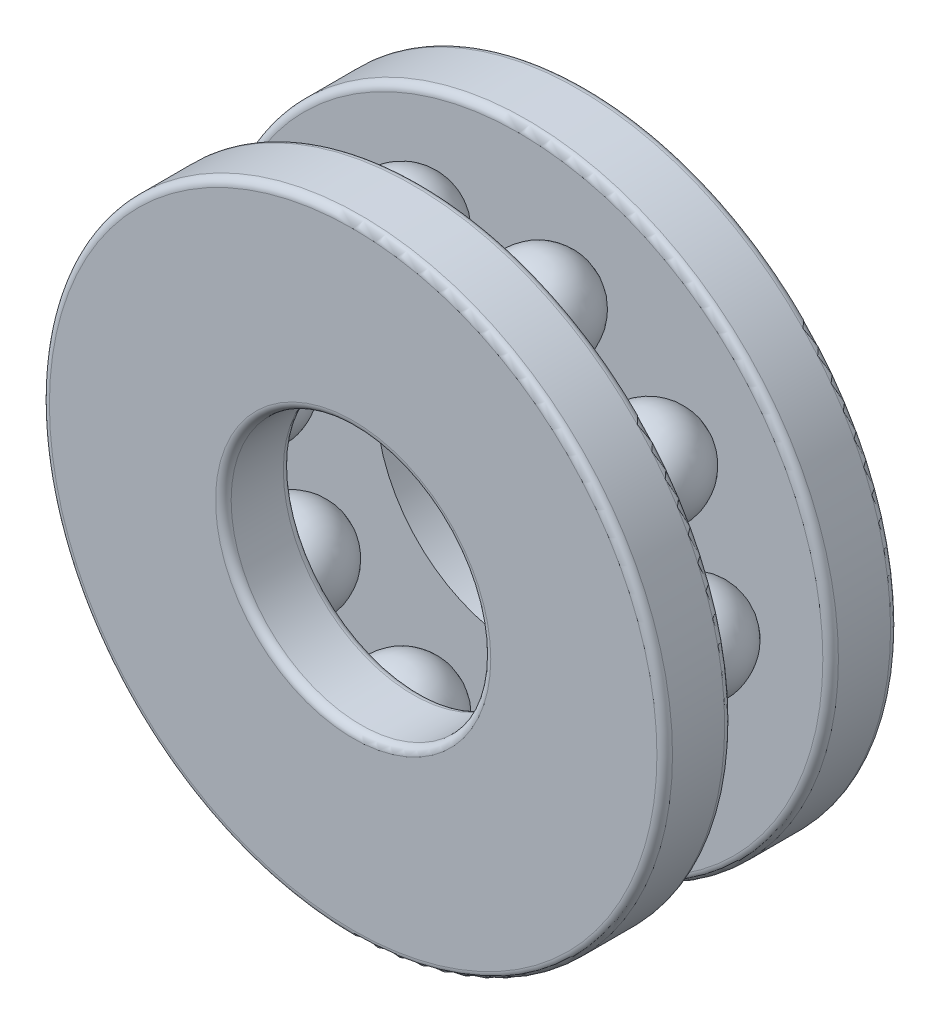
ISO-10303-21;
HEADER;
FILE_DESCRIPTION(('STEP AP214'),'2;1');
FILE_NAME('part.step','',(''),(''),'','','');
FILE_SCHEMA(('AUTOMOTIVE_DESIGN { 1 0 10303 214 1 1 1 1 }'));
ENDSEC;
DATA;
#1=APPLICATION_CONTEXT('core data for automotive mechanical design processes');
#2=APPLICATION_PROTOCOL_DEFINITION('international standard','automotive_design',2000,#1);
#3=PRODUCT_CONTEXT('',#1,'mechanical');
#4=PRODUCT('Part','Part','',(#3));
#5=PRODUCT_RELATED_PRODUCT_CATEGORY('part','',(#4));
#6=PRODUCT_DEFINITION_FORMATION('','',#4);
#7=PRODUCT_DEFINITION_CONTEXT('part definition',#1,'design');
#8=PRODUCT_DEFINITION('design','',#6,#7);
#9=PRODUCT_DEFINITION_SHAPE('','',#8);
#10=(LENGTH_UNIT() NAMED_UNIT(*) SI_UNIT(.MILLI.,.METRE.));
#11=(NAMED_UNIT(*) PLANE_ANGLE_UNIT() SI_UNIT($,.RADIAN.));
#12=(NAMED_UNIT(*) SI_UNIT($,.STERADIAN.) SOLID_ANGLE_UNIT());
#13=UNCERTAINTY_MEASURE_WITH_UNIT(LENGTH_MEASURE(1.E-05),#10,'distance_accuracy_value','');
#14=(GEOMETRIC_REPRESENTATION_CONTEXT(3) GLOBAL_UNCERTAINTY_ASSIGNED_CONTEXT((#13)) GLOBAL_UNIT_ASSIGNED_CONTEXT((#10,
#11,#12)) REPRESENTATION_CONTEXT('',''));
#15=CARTESIAN_POINT('',(0.,0.,0.));
#16=DIRECTION('',(0.,0.,1.));
#17=DIRECTION('',(1.,0.,0.));
#18=AXIS2_PLACEMENT_3D('',#15,#16,#17);
#19=CARTESIAN_POINT('',(6.87664445218705,-4.99617464448602,0.));
#20=DIRECTION('',(-0.809016994374947,0.587785252292473,0.));
#21=DIRECTION('',(0.,0.,-1.));
#22=AXIS2_PLACEMENT_3D('',#19,#20,#21);
#23=SPHERICAL_SURFACE('',#22,1.89);
#24=CARTESIAN_POINT('',(5.3476023328184,-3.88526051765325,0.));
#25=VERTEX_POINT('',#24);
#26=VERTEX_LOOP('',#25);
#27=FACE_BOUND('',#26,.T.);
#28=ADVANCED_FACE('F38',(#27),#23,.T.);
#29=CLOSED_SHELL('',(#28));
#30=MANIFOLD_SOLID_BREP('B2',#29);
#31=CARTESIAN_POINT('',(2.62664445218705,-8.08398038850881,0.));
#32=DIRECTION('',(-0.309016994374947,0.951056516295154,0.));
#33=DIRECTION('',(0.,0.,-1.));
#34=AXIS2_PLACEMENT_3D('',#31,#32,#33);
#35=SPHERICAL_SURFACE('',#34,1.89);
#36=CARTESIAN_POINT('',(2.0426023328184,-6.28648357271097,0.));
#37=VERTEX_POINT('',#36);
#38=VERTEX_LOOP('',#37);
#39=FACE_BOUND('',#38,.T.);
#40=ADVANCED_FACE('F57',(#39),#35,.T.);
#41=CLOSED_SHELL('',(#40));
#42=MANIFOLD_SOLID_BREP('B6',#41);
#43=CARTESIAN_POINT('',(-2.62664445218705,-8.08398038850881,0.));
#44=DIRECTION('',(0.309016994374948,0.951056516295154,0.));
#45=DIRECTION('',(0.,0.,-1.));
#46=AXIS2_PLACEMENT_3D('',#43,#44,#45);
#47=SPHERICAL_SURFACE('',#46,1.89);
#48=CARTESIAN_POINT('',(-2.0426023328184,-6.28648357271097,0.));
#49=VERTEX_POINT('',#48);
#50=VERTEX_LOOP('',#49);
#51=FACE_BOUND('',#50,.T.);
#52=ADVANCED_FACE('F76',(#51),#47,.T.);
#53=CLOSED_SHELL('',(#52));
#54=MANIFOLD_SOLID_BREP('B34',#53);
#55=CARTESIAN_POINT('',(-6.87664445218706,-4.99617464448602,0.));
#56=DIRECTION('',(0.809016994374948,0.587785252292473,0.));
#57=DIRECTION('',(0.,0.,-1.));
#58=AXIS2_PLACEMENT_3D('',#55,#56,#57);
#59=SPHERICAL_SURFACE('',#58,1.89);
#60=CARTESIAN_POINT('',(-5.34760233281841,-3.88526051765325,0.));
#61=VERTEX_POINT('',#60);
#62=VERTEX_LOOP('',#61);
#63=FACE_BOUND('',#62,.T.);
#64=ADVANCED_FACE('F95',(#63),#59,.T.);
#65=CLOSED_SHELL('',(#64));
#66=MANIFOLD_SOLID_BREP('B53',#65);
#67=CARTESIAN_POINT('',(-8.5,0.,0.));
#68=DIRECTION('',(1.,0.,0.));
#69=DIRECTION('',(0.,0.,-1.));
#70=AXIS2_PLACEMENT_3D('',#67,#68,#69);
#71=SPHERICAL_SURFACE('',#70,1.89);
#72=CARTESIAN_POINT('',(-6.61,0.,0.));
#73=VERTEX_POINT('',#72);
#74=VERTEX_LOOP('',#73);
#75=FACE_BOUND('',#74,.T.);
#76=ADVANCED_FACE('F114',(#75),#71,.T.);
#77=CLOSED_SHELL('',(#76));
#78=MANIFOLD_SOLID_BREP('B72',#77);
#79=CARTESIAN_POINT('',(-6.87664445218705,4.99617464448602,0.));
#80=DIRECTION('',(0.809016994374947,-0.587785252292473,0.));
#81=DIRECTION('',(0.,0.,-1.));
#82=AXIS2_PLACEMENT_3D('',#79,#80,#81);
#83=SPHERICAL_SURFACE('',#82,1.89);
#84=CARTESIAN_POINT('',(-5.3476023328184,3.88526051765325,0.));
#85=VERTEX_POINT('',#84);
#86=VERTEX_LOOP('',#85);
#87=FACE_BOUND('',#86,.T.);
#88=ADVANCED_FACE('F133',(#87),#83,.T.);
#89=CLOSED_SHELL('',(#88));
#90=MANIFOLD_SOLID_BREP('B91',#89);
#91=CARTESIAN_POINT('',(-2.62664445218705,8.08398038850881,0.));
#92=DIRECTION('',(0.309016994374947,-0.951056516295154,0.));
#93=DIRECTION('',(0.,0.,-1.));
#94=AXIS2_PLACEMENT_3D('',#91,#92,#93);
#95=SPHERICAL_SURFACE('',#94,1.89);
#96=CARTESIAN_POINT('',(-2.0426023328184,6.28648357271097,0.));
#97=VERTEX_POINT('',#96);
#98=VERTEX_LOOP('',#97);
#99=FACE_BOUND('',#98,.T.);
#100=ADVANCED_FACE('F152',(#99),#95,.T.);
#101=CLOSED_SHELL('',(#100));
#102=MANIFOLD_SOLID_BREP('B110',#101);
#103=CARTESIAN_POINT('',(2.62664445218705,8.08398038850881,0.));
#104=DIRECTION('',(-0.309016994374948,-0.951056516295154,0.));
#105=DIRECTION('',(0.,0.,-1.));
#106=AXIS2_PLACEMENT_3D('',#103,#104,#105);
#107=SPHERICAL_SURFACE('',#106,1.89);
#108=CARTESIAN_POINT('',(2.0426023328184,6.28648357271097,0.));
#109=VERTEX_POINT('',#108);
#110=VERTEX_LOOP('',#109);
#111=FACE_BOUND('',#110,.T.);
#112=ADVANCED_FACE('F171',(#111),#107,.T.);
#113=CLOSED_SHELL('',(#112));
#114=MANIFOLD_SOLID_BREP('B129',#113);
#115=CARTESIAN_POINT('',(6.87664445218705,4.99617464448602,0.));
#116=DIRECTION('',(-0.809016994374947,-0.587785252292473,0.));
#117=DIRECTION('',(0.,0.,-1.));
#118=AXIS2_PLACEMENT_3D('',#115,#116,#117);
#119=SPHERICAL_SURFACE('',#118,1.89);
#120=CARTESIAN_POINT('',(5.3476023328184,3.88526051765325,0.));
#121=VERTEX_POINT('',#120);
#122=VERTEX_LOOP('',#121);
#123=FACE_BOUND('',#122,.T.);
#124=ADVANCED_FACE('F190',(#123),#119,.T.);
#125=CLOSED_SHELL('',(#124));
#126=MANIFOLD_SOLID_BREP('B148',#125);
#127=CARTESIAN_POINT('',(8.5,0.,0.));
#128=DIRECTION('',(-1.,0.,0.));
#129=DIRECTION('',(0.,0.,-1.));
#130=AXIS2_PLACEMENT_3D('',#127,#128,#129);
#131=SPHERICAL_SURFACE('',#130,1.89);
#132=CARTESIAN_POINT('',(6.61,0.,0.));
#133=VERTEX_POINT('',#132);
#134=VERTEX_LOOP('',#133);
#135=FACE_BOUND('',#134,.T.);
#136=ADVANCED_FACE('F211',(#135),#131,.T.);
#137=CLOSED_SHELL('',(#136));
#138=MANIFOLD_SOLID_BREP('B167',#137);
#139=CARTESIAN_POINT('',(0.,0.,7.75));
#140=DIRECTION('',(0.,0.,1.));
#141=DIRECTION('',(1.,0.,0.));
#142=AXIS2_PLACEMENT_3D('',#139,#140,#141);
#143=CYLINDRICAL_SURFACE('',#142,5.5);
#144=CARTESIAN_POINT('',(0.,0.,-1.89));
#145=DIRECTION('',(0.,0.,1.));
#146=DIRECTION('',(1.,0.,0.));
#147=AXIS2_PLACEMENT_3D('',#144,#145,#146);
#148=CIRCLE('',#147,5.5);
#149=CARTESIAN_POINT('',(5.5,0.,-1.89));
#150=VERTEX_POINT('',#149);
#151=EDGE_CURVE('E251',#150,#150,#148,.T.);
#152=ORIENTED_EDGE('',*,*,#151,.T.);
#153=EDGE_LOOP('',(#152));
#154=FACE_BOUND('',#153,.T.);
#155=CARTESIAN_POINT('',(0.,0.,-4.5));
#156=DIRECTION('',(0.,0.,1.));
#157=DIRECTION('',(1.,0.,0.));
#158=AXIS2_PLACEMENT_3D('',#155,#156,#157);
#159=CIRCLE('',#158,5.5);
#160=CARTESIAN_POINT('',(5.5,0.,-4.5));
#161=VERTEX_POINT('',#160);
#162=EDGE_CURVE('E254',#161,#161,#159,.T.);
#163=ORIENTED_EDGE('',*,*,#162,.F.);
#164=EDGE_LOOP('',(#163));
#165=FACE_BOUND('',#164,.T.);
#166=ADVANCED_FACE('F231',(#154,#165),#143,.F.);
#167=CARTESIAN_POINT('',(5.5,0.,-1.89));
#168=DIRECTION('',(0.,0.,1.));
#169=DIRECTION('',(1.,0.,0.));
#170=AXIS2_PLACEMENT_3D('',#167,#168,#169);
#171=PLANE('',#170);
#172=CARTESIAN_POINT('',(0.,0.,-1.89));
#173=DIRECTION('',(0.,0.,1.));
#174=DIRECTION('',(1.,0.,0.));
#175=AXIS2_PLACEMENT_3D('',#172,#173,#174);
#176=CIRCLE('',#175,11.7);
#177=CARTESIAN_POINT('',(11.7,0.,-1.89));
#178=VERTEX_POINT('',#177);
#179=EDGE_CURVE('E210',#178,#178,#176,.T.);
#180=ORIENTED_EDGE('',*,*,#179,.T.);
#181=EDGE_LOOP('',(#180));
#182=FACE_BOUND('',#181,.T.);
#183=ORIENTED_EDGE('',*,*,#151,.F.);
#184=EDGE_LOOP('',(#183));
#185=FACE_BOUND('',#184,.T.);
#186=ADVANCED_FACE('F261',(#182,#185),#171,.T.);
#187=CARTESIAN_POINT('',(0.,0.,7.75));
#188=DIRECTION('',(0.,0.,1.));
#189=DIRECTION('',(1.,0.,0.));
#190=AXIS2_PLACEMENT_3D('',#187,#188,#189);
#191=CYLINDRICAL_SURFACE('',#190,12.);
#192=CARTESIAN_POINT('',(0.,0.,-4.2));
#193=DIRECTION('',(0.,0.,-1.));
#194=DIRECTION('',(-1.,0.,0.));
#195=AXIS2_PLACEMENT_3D('',#192,#193,#194);
#196=CIRCLE('',#195,12.);
#197=CARTESIAN_POINT('',(-12.,0.,-4.2));
#198=VERTEX_POINT('',#197);
#199=EDGE_CURVE('E242',#198,#198,#196,.F.);
#200=ORIENTED_EDGE('',*,*,#199,.T.);
#201=EDGE_LOOP('',(#200));
#202=FACE_BOUND('',#201,.T.);
#203=CARTESIAN_POINT('',(0.,0.,-2.19));
#204=DIRECTION('',(0.,0.,1.));
#205=DIRECTION('',(1.,0.,0.));
#206=AXIS2_PLACEMENT_3D('',#203,#204,#205);
#207=CIRCLE('',#206,12.);
#208=CARTESIAN_POINT('',(12.,0.,-2.19));
#209=VERTEX_POINT('',#208);
#210=EDGE_CURVE('E246',#209,#209,#207,.F.);
#211=ORIENTED_EDGE('',*,*,#210,.T.);
#212=EDGE_LOOP('',(#211));
#213=FACE_BOUND('',#212,.T.);
#214=ADVANCED_FACE('F267',(#202,#213),#191,.T.);
#215=CARTESIAN_POINT('',(12.,0.,-4.5));
#216=DIRECTION('',(0.,0.,-1.));
#217=DIRECTION('',(-1.,0.,0.));
#218=AXIS2_PLACEMENT_3D('',#215,#216,#217);
#219=PLANE('',#218);
#220=CARTESIAN_POINT('',(0.,0.,-4.5));
#221=DIRECTION('',(0.,0.,-1.));
#222=DIRECTION('',(-1.,0.,0.));
#223=AXIS2_PLACEMENT_3D('',#220,#221,#222);
#224=CIRCLE('',#223,11.7);
#225=CARTESIAN_POINT('',(-11.7,0.,-4.5));
#226=VERTEX_POINT('',#225);
#227=EDGE_CURVE('E238',#226,#226,#224,.T.);
#228=ORIENTED_EDGE('',*,*,#227,.T.);
#229=EDGE_LOOP('',(#228));
#230=FACE_BOUND('',#229,.T.);
#231=ORIENTED_EDGE('',*,*,#162,.T.);
#232=EDGE_LOOP('',(#231));
#233=FACE_BOUND('',#232,.T.);
#234=ADVANCED_FACE('F258',(#230,#233),#219,.T.);
#235=CARTESIAN_POINT('',(0.,0.,-4.2));
#236=DIRECTION('',(0.,0.,-1.));
#237=DIRECTION('',(-1.,0.,0.));
#238=AXIS2_PLACEMENT_3D('',#235,#236,#237);
#239=TOROIDAL_SURFACE('',#238,11.7,0.3);
#240=ORIENTED_EDGE('',*,*,#227,.F.);
#241=EDGE_LOOP('',(#240));
#242=FACE_BOUND('',#241,.T.);
#243=ORIENTED_EDGE('',*,*,#199,.F.);
#244=EDGE_LOOP('',(#243));
#245=FACE_BOUND('',#244,.T.);
#246=ADVANCED_FACE('F270',(#242,#245),#239,.T.);
#247=CARTESIAN_POINT('',(0.,0.,-2.19));
#248=DIRECTION('',(0.,0.,1.));
#249=DIRECTION('',(1.,0.,0.));
#250=AXIS2_PLACEMENT_3D('',#247,#248,#249);
#251=TOROIDAL_SURFACE('',#250,11.7,0.3);
#252=ORIENTED_EDGE('',*,*,#210,.F.);
#253=EDGE_LOOP('',(#252));
#254=FACE_BOUND('',#253,.T.);
#255=ORIENTED_EDGE('',*,*,#179,.F.);
#256=EDGE_LOOP('',(#255));
#257=FACE_BOUND('',#256,.T.);
#258=ADVANCED_FACE('F233',(#254,#257),#251,.T.);
#259=CLOSED_SHELL('',(#166,#186,#214,#234,#246,#258));
#260=MANIFOLD_SOLID_BREP('B186',#259);
#261=CARTESIAN_POINT('',(0.,0.,7.75));
#262=DIRECTION('',(0.,0.,1.));
#263=DIRECTION('',(1.,0.,0.));
#264=AXIS2_PLACEMENT_3D('',#261,#262,#263);
#265=CYLINDRICAL_SURFACE('',#264,5.);
#266=CARTESIAN_POINT('',(0.,0.,2.19));
#267=DIRECTION('',(0.,0.,-1.));
#268=DIRECTION('',(-1.,0.,0.));
#269=AXIS2_PLACEMENT_3D('',#266,#267,#268);
#270=CIRCLE('',#269,5.);
#271=CARTESIAN_POINT('',(-5.,0.,2.19));
#272=VERTEX_POINT('',#271);
#273=EDGE_CURVE('E343',#272,#272,#270,.T.);
#274=ORIENTED_EDGE('',*,*,#273,.T.);
#275=EDGE_LOOP('',(#274));
#276=FACE_BOUND('',#275,.T.);
#277=CARTESIAN_POINT('',(0.,0.,4.2));
#278=DIRECTION('',(0.,0.,1.));
#279=DIRECTION('',(1.,0.,0.));
#280=AXIS2_PLACEMENT_3D('',#277,#278,#279);
#281=CIRCLE('',#280,5.);
#282=CARTESIAN_POINT('',(5.,0.,4.2));
#283=VERTEX_POINT('',#282);
#284=EDGE_CURVE('E346',#283,#283,#281,.T.);
#285=ORIENTED_EDGE('',*,*,#284,.T.);
#286=EDGE_LOOP('',(#285));
#287=FACE_BOUND('',#286,.T.);
#288=ADVANCED_FACE('F323',(#276,#287),#265,.F.);
#289=CARTESIAN_POINT('',(5.,0.,4.5));
#290=DIRECTION('',(0.,0.,1.));
#291=DIRECTION('',(1.,0.,0.));
#292=AXIS2_PLACEMENT_3D('',#289,#290,#291);
#293=PLANE('',#292);
#294=CARTESIAN_POINT('',(0.,0.,4.5));
#295=DIRECTION('',(0.,0.,1.));
#296=DIRECTION('',(1.,0.,0.));
#297=AXIS2_PLACEMENT_3D('',#294,#295,#296);
#298=CIRCLE('',#297,11.7);
#299=CARTESIAN_POINT('',(11.7,0.,4.5));
#300=VERTEX_POINT('',#299);
#301=EDGE_CURVE('E230',#300,#300,#298,.T.);
#302=ORIENTED_EDGE('',*,*,#301,.T.);
#303=EDGE_LOOP('',(#302));
#304=FACE_BOUND('',#303,.T.);
#305=CARTESIAN_POINT('',(0.,0.,4.5));
#306=DIRECTION('',(0.,0.,1.));
#307=DIRECTION('',(1.,0.,0.));
#308=AXIS2_PLACEMENT_3D('',#305,#306,#307);
#309=CIRCLE('',#308,5.3);
#310=CARTESIAN_POINT('',(5.3,0.,4.5));
#311=VERTEX_POINT('',#310);
#312=EDGE_CURVE('E330',#311,#311,#309,.F.);
#313=ORIENTED_EDGE('',*,*,#312,.T.);
#314=EDGE_LOOP('',(#313));
#315=FACE_BOUND('',#314,.T.);
#316=ADVANCED_FACE('F369',(#304,#315),#293,.T.);
#317=CARTESIAN_POINT('',(0.,0.,7.75));
#318=DIRECTION('',(0.,0.,1.));
#319=DIRECTION('',(1.,0.,0.));
#320=AXIS2_PLACEMENT_3D('',#317,#318,#319);
#321=CYLINDRICAL_SURFACE('',#320,12.);
#322=CARTESIAN_POINT('',(0.,0.,2.19));
#323=DIRECTION('',(0.,0.,-1.));
#324=DIRECTION('',(-1.,0.,0.));
#325=AXIS2_PLACEMENT_3D('',#322,#323,#324);
#326=CIRCLE('',#325,12.);
#327=CARTESIAN_POINT('',(-12.,0.,2.19));
#328=VERTEX_POINT('',#327);
#329=EDGE_CURVE('E334',#328,#328,#326,.F.);
#330=ORIENTED_EDGE('',*,*,#329,.T.);
#331=EDGE_LOOP('',(#330));
#332=FACE_BOUND('',#331,.T.);
#333=CARTESIAN_POINT('',(0.,0.,4.2));
#334=DIRECTION('',(0.,0.,1.));
#335=DIRECTION('',(1.,0.,0.));
#336=AXIS2_PLACEMENT_3D('',#333,#334,#335);
#337=CIRCLE('',#336,12.);
#338=CARTESIAN_POINT('',(12.,0.,4.2));
#339=VERTEX_POINT('',#338);
#340=EDGE_CURVE('E338',#339,#339,#337,.F.);
#341=ORIENTED_EDGE('',*,*,#340,.T.);
#342=EDGE_LOOP('',(#341));
#343=FACE_BOUND('',#342,.T.);
#344=ADVANCED_FACE('F366',(#332,#343),#321,.T.);
#345=CARTESIAN_POINT('',(12.,0.,1.89));
#346=DIRECTION('',(0.,0.,-1.));
#347=DIRECTION('',(-1.,0.,0.));
#348=AXIS2_PLACEMENT_3D('',#345,#346,#347);
#349=PLANE('',#348);
#350=CARTESIAN_POINT('',(0.,0.,1.89));
#351=DIRECTION('',(0.,0.,-1.));
#352=DIRECTION('',(-1.,0.,0.));
#353=AXIS2_PLACEMENT_3D('',#350,#351,#352);
#354=CIRCLE('',#353,5.3);
#355=CARTESIAN_POINT('',(-5.3,0.,1.89));
#356=VERTEX_POINT('',#355);
#357=EDGE_CURVE('E349',#356,#356,#354,.F.);
#358=ORIENTED_EDGE('',*,*,#357,.T.);
#359=EDGE_LOOP('',(#358));
#360=FACE_BOUND('',#359,.T.);
#361=CARTESIAN_POINT('',(0.,0.,1.89));
#362=DIRECTION('',(0.,0.,-1.));
#363=DIRECTION('',(-1.,0.,0.));
#364=AXIS2_PLACEMENT_3D('',#361,#362,#363);
#365=CIRCLE('',#364,11.7);
#366=CARTESIAN_POINT('',(-11.7,0.,1.89));
#367=VERTEX_POINT('',#366);
#368=EDGE_CURVE('E352',#367,#367,#365,.T.);
#369=ORIENTED_EDGE('',*,*,#368,.T.);
#370=EDGE_LOOP('',(#369));
#371=FACE_BOUND('',#370,.T.);
#372=ADVANCED_FACE('F356',(#360,#371),#349,.T.);
#373=CARTESIAN_POINT('',(0.,0.,2.19));
#374=DIRECTION('',(0.,0.,-1.));
#375=DIRECTION('',(-1.,0.,0.));
#376=AXIS2_PLACEMENT_3D('',#373,#374,#375);
#377=TOROIDAL_SURFACE('',#376,5.3,0.3);
#378=ORIENTED_EDGE('',*,*,#273,.F.);
#379=EDGE_LOOP('',(#378));
#380=FACE_BOUND('',#379,.T.);
#381=ORIENTED_EDGE('',*,*,#357,.F.);
#382=EDGE_LOOP('',(#381));
#383=FACE_BOUND('',#382,.T.);
#384=ADVANCED_FACE('F362',(#380,#383),#377,.T.);
#385=CARTESIAN_POINT('',(0.,0.,2.19));
#386=DIRECTION('',(0.,0.,-1.));
#387=DIRECTION('',(-1.,0.,0.));
#388=AXIS2_PLACEMENT_3D('',#385,#386,#387);
#389=TOROIDAL_SURFACE('',#388,11.7,0.3);
#390=ORIENTED_EDGE('',*,*,#368,.F.);
#391=EDGE_LOOP('',(#390));
#392=FACE_BOUND('',#391,.T.);
#393=ORIENTED_EDGE('',*,*,#329,.F.);
#394=EDGE_LOOP('',(#393));
#395=FACE_BOUND('',#394,.T.);
#396=ADVANCED_FACE('F358',(#392,#395),#389,.T.);
#397=CARTESIAN_POINT('',(0.,0.,4.2));
#398=DIRECTION('',(0.,0.,1.));
#399=DIRECTION('',(1.,0.,0.));
#400=AXIS2_PLACEMENT_3D('',#397,#398,#399);
#401=TOROIDAL_SURFACE('',#400,11.7,0.3);
#402=ORIENTED_EDGE('',*,*,#340,.F.);
#403=EDGE_LOOP('',(#402));
#404=FACE_BOUND('',#403,.T.);
#405=ORIENTED_EDGE('',*,*,#301,.F.);
#406=EDGE_LOOP('',(#405));
#407=FACE_BOUND('',#406,.T.);
#408=ADVANCED_FACE('F361',(#404,#407),#401,.T.);
#409=CARTESIAN_POINT('',(0.,0.,4.2));
#410=DIRECTION('',(0.,0.,1.));
#411=DIRECTION('',(1.,0.,0.));
#412=AXIS2_PLACEMENT_3D('',#409,#410,#411);
#413=TOROIDAL_SURFACE('',#412,5.3,0.3);
#414=ORIENTED_EDGE('',*,*,#312,.F.);
#415=EDGE_LOOP('',(#414));
#416=FACE_BOUND('',#415,.T.);
#417=ORIENTED_EDGE('',*,*,#284,.F.);
#418=EDGE_LOOP('',(#417));
#419=FACE_BOUND('',#418,.T.);
#420=ADVANCED_FACE('F325',(#416,#419),#413,.T.);
#421=CLOSED_SHELL('',(#288,#316,#344,#372,#384,#396,#408,#420));
#422=MANIFOLD_SOLID_BREP('B205',#421);
#423=ADVANCED_BREP_SHAPE_REPRESENTATION('',(#18,#30,#42,#54,#66,#78,#90,#102,#114,#126,#138,
#260,#422),#14);
#424=SHAPE_DEFINITION_REPRESENTATION(#9,#423);
ENDSEC;
END-ISO-10303-21;
